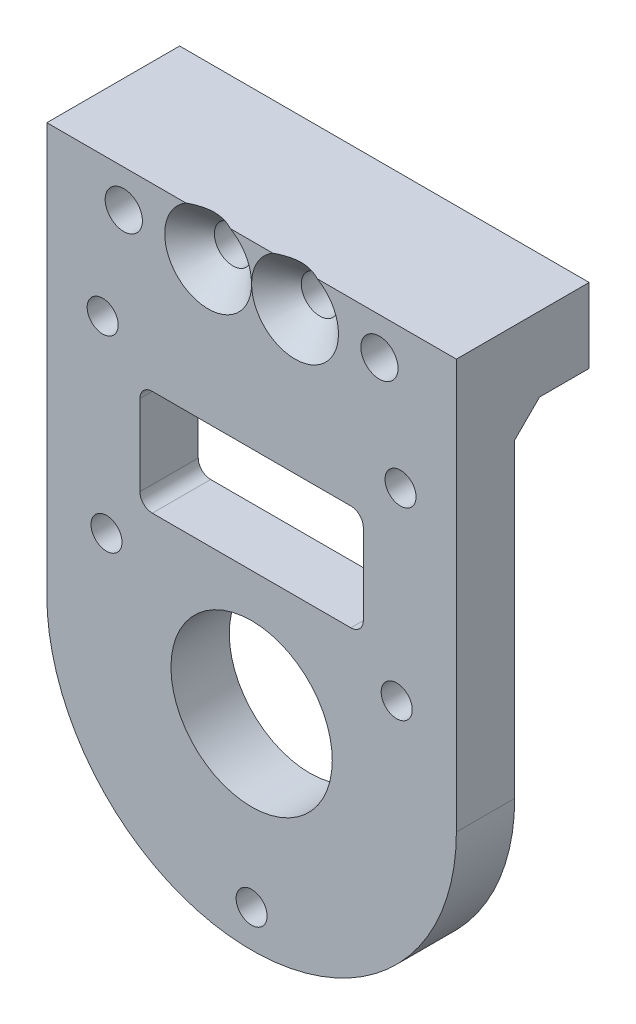
ISO-10303-21;
HEADER;
FILE_DESCRIPTION(('STEP AP214'),'2;1');
FILE_NAME('part.step','',(''),(''),'','','');
FILE_SCHEMA(('AUTOMOTIVE_DESIGN { 1 0 10303 214 1 1 1 1 }'));
ENDSEC;
DATA;
#1=APPLICATION_CONTEXT('core data for automotive mechanical design processes');
#2=APPLICATION_PROTOCOL_DEFINITION('international standard','automotive_design',2000,#1);
#3=PRODUCT_CONTEXT('',#1,'mechanical');
#4=PRODUCT('Part','Part','',(#3));
#5=PRODUCT_RELATED_PRODUCT_CATEGORY('part','',(#4));
#6=PRODUCT_DEFINITION_FORMATION('','',#4);
#7=PRODUCT_DEFINITION_CONTEXT('part definition',#1,'design');
#8=PRODUCT_DEFINITION('design','',#6,#7);
#9=PRODUCT_DEFINITION_SHAPE('','',#8);
#10=(LENGTH_UNIT() NAMED_UNIT(*) SI_UNIT(.MILLI.,.METRE.));
#11=(NAMED_UNIT(*) PLANE_ANGLE_UNIT() SI_UNIT($,.RADIAN.));
#12=(NAMED_UNIT(*) SI_UNIT($,.STERADIAN.) SOLID_ANGLE_UNIT());
#13=UNCERTAINTY_MEASURE_WITH_UNIT(LENGTH_MEASURE(1.E-05),#10,'distance_accuracy_value','');
#14=(GEOMETRIC_REPRESENTATION_CONTEXT(3) GLOBAL_UNCERTAINTY_ASSIGNED_CONTEXT((#13)) GLOBAL_UNIT_ASSIGNED_CONTEXT((#10,
#11,#12)) REPRESENTATION_CONTEXT('',''));
#15=CARTESIAN_POINT('',(0.,0.,0.));
#16=DIRECTION('',(0.,0.,1.));
#17=DIRECTION('',(1.,0.,0.));
#18=AXIS2_PLACEMENT_3D('',#15,#16,#17);
#19=CARTESIAN_POINT('',(-22.9121128013917,-0.330201782079756,4.7));
#20=DIRECTION('',(0.,0.,1.));
#21=DIRECTION('',(1.,0.,0.));
#22=AXIS2_PLACEMENT_3D('',#19,#20,#21);
#23=PLANE('',#22);
#24=CARTESIAN_POINT('',(-26.4121128013917,29.6698090418937,4.7));
#25=DIRECTION('',(0.,0.,-1.));
#26=DIRECTION('',(1.,0.,0.));
#27=AXIS2_PLACEMENT_3D('',#24,#25,#26);
#28=CIRCLE('',#27,3.5);
#29=CARTESIAN_POINT('',(-24.6093371636052,32.669809041861,4.7));
#30=VERTEX_POINT('',#29);
#31=CARTESIAN_POINT('',(-22.9121128013917,29.6698090418937,4.7));
#32=VERTEX_POINT('',#31);
#33=EDGE_CURVE('E33',#30,#32,#28,.T.);
#34=ORIENTED_EDGE('',*,*,#33,.T.);
#35=CARTESIAN_POINT('',(-19.4121128013917,29.6698090418937,4.7));
#36=DIRECTION('',(0.,0.,-1.));
#37=DIRECTION('',(1.,0.,0.));
#38=AXIS2_PLACEMENT_3D('',#35,#36,#37);
#39=CIRCLE('',#38,3.5);
#40=CARTESIAN_POINT('',(-21.2148884391781,32.669809041861,4.7));
#41=VERTEX_POINT('',#40);
#42=EDGE_CURVE('E11',#32,#41,#39,.T.);
#43=ORIENTED_EDGE('',*,*,#42,.T.);
#44=DIRECTION('',(-1.,0.,0.));
#45=VECTOR('',#44,1.);
#46=CARTESIAN_POINT('',(-6.41211280139168,32.6698090418611,4.7));
#47=LINE('',#46,#45);
#48=EDGE_CURVE('E371',#41,#30,#47,.T.);
#49=ORIENTED_EDGE('',*,*,#48,.T.);
#50=EDGE_LOOP('',(#34,#43,#49));
#51=FACE_BOUND('',#50,.T.);
#52=ADVANCED_FACE('F17',(#51),#23,.T.);
#53=CARTESIAN_POINT('',(0.,26.6698090416414,0.));
#54=DIRECTION('',(0.,-1.,0.));
#55=DIRECTION('',(0.,0.,-1.));
#56=AXIS2_PLACEMENT_3D('',#53,#54,#55);
#57=PLANE('',#56);
#58=DIRECTION('',(1.,0.,0.));
#59=VECTOR('',#58,1.);
#60=CARTESIAN_POINT('',(-39.4121128013917,26.6698090416414,-6.));
#61=LINE('',#60,#59);
#62=CARTESIAN_POINT('',(-39.4121128013917,26.6698090416414,-6.));
#63=VERTEX_POINT('',#62);
#64=CARTESIAN_POINT('',(-6.41211280139167,26.6698090416414,-6.));
#65=VERTEX_POINT('',#64);
#66=EDGE_CURVE('E194',#63,#65,#61,.T.);
#67=ORIENTED_EDGE('',*,*,#66,.T.);
#68=DIRECTION('',(0.,0.,1.));
#69=VECTOR('',#68,1.);
#70=CARTESIAN_POINT('',(-6.41211280139167,26.6698090416414,0.));
#71=LINE('',#70,#69);
#72=CARTESIAN_POINT('',(-6.41211280139167,26.6698090416414,-2.));
#73=VERTEX_POINT('',#72);
#74=EDGE_CURVE('E209',#65,#73,#71,.T.);
#75=ORIENTED_EDGE('',*,*,#74,.T.);
#76=DIRECTION('',(1.,0.,0.));
#77=VECTOR('',#76,1.);
#78=CARTESIAN_POINT('',(0.,26.6698090416414,-2.));
#79=LINE('',#78,#77);
#80=CARTESIAN_POINT('',(-39.4121128013917,26.6698090416414,-2.));
#81=VERTEX_POINT('',#80);
#82=EDGE_CURVE('E202',#81,#73,#79,.T.);
#83=ORIENTED_EDGE('',*,*,#82,.F.);
#84=DIRECTION('',(0.,0.,-1.));
#85=VECTOR('',#84,1.);
#86=CARTESIAN_POINT('',(-39.4121128013917,26.6698090416414,0.));
#87=LINE('',#86,#85);
#88=EDGE_CURVE('E206',#81,#63,#87,.T.);
#89=ORIENTED_EDGE('',*,*,#88,.T.);
#90=EDGE_LOOP('',(#67,#75,#83,#89));
#91=FACE_BOUND('',#90,.T.);
#92=ADVANCED_FACE('F204',(#91),#57,.T.);
#93=CARTESIAN_POINT('',(0.,24.6698090416413,0.));
#94=DIRECTION('',(0.,0.707106781186544,0.707106781186551));
#95=DIRECTION('',(1.,0.,0.));
#96=AXIS2_PLACEMENT_3D('',#93,#94,#95);
#97=PLANE('',#96);
#98=DIRECTION('',(0.,-0.70710678118655,0.707106781186545));
#99=VECTOR('',#98,1.);
#100=CARTESIAN_POINT('',(-39.4121128013917,27.6698090416414,-3.));
#101=LINE('',#100,#99);
#102=CARTESIAN_POINT('',(-39.4121128013917,24.6698090416413,0.));
#103=VERTEX_POINT('',#102);
#104=EDGE_CURVE('E216',#81,#103,#101,.T.);
#105=ORIENTED_EDGE('',*,*,#104,.F.);
#106=ORIENTED_EDGE('',*,*,#82,.T.);
#107=DIRECTION('',(0.,0.70710678118655,-0.707106781186545));
#108=VECTOR('',#107,1.);
#109=CARTESIAN_POINT('',(-6.41211280139167,24.6698090416413,0.));
#110=LINE('',#109,#108);
#111=CARTESIAN_POINT('',(-6.41211280139167,24.6698090416413,0.));
#112=VERTEX_POINT('',#111);
#113=EDGE_CURVE('E380',#112,#73,#110,.T.);
#114=ORIENTED_EDGE('',*,*,#113,.F.);
#115=DIRECTION('',(1.,0.,0.));
#116=VECTOR('',#115,1.);
#117=CARTESIAN_POINT('',(0.,24.6698090416413,0.));
#118=LINE('',#117,#116);
#119=EDGE_CURVE('E218',#103,#112,#118,.T.);
#120=ORIENTED_EDGE('',*,*,#119,.F.);
#121=EDGE_LOOP('',(#105,#106,#114,#120));
#122=FACE_BOUND('',#121,.T.);
#123=ADVANCED_FACE('F217',(#122),#97,.F.);
#124=CARTESIAN_POINT('',(-39.4121128013917,54.6698090418938,-6.));
#125=DIRECTION('',(0.,0.,1.));
#126=DIRECTION('',(0.,-1.,0.));
#127=AXIS2_PLACEMENT_3D('',#124,#125,#126);
#128=PLANE('',#127);
#129=CARTESIAN_POINT('',(-12.612112801392,29.6698090418937,-6.));
#130=DIRECTION('',(0.,0.,-1.));
#131=DIRECTION('',(0.,-1.,0.));
#132=AXIS2_PLACEMENT_3D('',#129,#130,#131);
#133=CIRCLE('',#132,1.5);
#134=CARTESIAN_POINT('',(-12.612112801392,28.1698090418937,-6.));
#135=VERTEX_POINT('',#134);
#136=EDGE_CURVE('E287',#135,#135,#133,.T.);
#137=ORIENTED_EDGE('',*,*,#136,.F.);
#138=EDGE_LOOP('',(#137));
#139=FACE_BOUND('',#138,.T.);
#140=CARTESIAN_POINT('',(-19.4121128013917,29.6698090418937,-6.));
#141=DIRECTION('',(0.,0.,-1.));
#142=DIRECTION('',(0.,-1.,0.));
#143=AXIS2_PLACEMENT_3D('',#140,#141,#142);
#144=CIRCLE('',#143,1.5);
#145=CARTESIAN_POINT('',(-19.4121128013917,28.1698090418937,-6.));
#146=VERTEX_POINT('',#145);
#147=EDGE_CURVE('E277',#146,#146,#144,.T.);
#148=ORIENTED_EDGE('',*,*,#147,.F.);
#149=EDGE_LOOP('',(#148));
#150=FACE_BOUND('',#149,.T.);
#151=CARTESIAN_POINT('',(-26.4121128013917,29.6698090418937,-6.));
#152=DIRECTION('',(0.,0.,-1.));
#153=DIRECTION('',(0.,-1.,0.));
#154=AXIS2_PLACEMENT_3D('',#151,#152,#153);
#155=CIRCLE('',#154,1.5);
#156=CARTESIAN_POINT('',(-26.4121128013917,28.1698090418937,-6.));
#157=VERTEX_POINT('',#156);
#158=EDGE_CURVE('E284',#157,#157,#155,.T.);
#159=ORIENTED_EDGE('',*,*,#158,.F.);
#160=EDGE_LOOP('',(#159));
#161=FACE_BOUND('',#160,.T.);
#162=CARTESIAN_POINT('',(-33.2121128013917,29.6698090418937,-6.));
#163=DIRECTION('',(0.,0.,-1.));
#164=DIRECTION('',(0.,-1.,0.));
#165=AXIS2_PLACEMENT_3D('',#162,#163,#164);
#166=CIRCLE('',#165,1.5);
#167=CARTESIAN_POINT('',(-33.2121128013917,28.1698090418937,-6.));
#168=VERTEX_POINT('',#167);
#169=EDGE_CURVE('E298',#168,#168,#166,.T.);
#170=ORIENTED_EDGE('',*,*,#169,.F.);
#171=EDGE_LOOP('',(#170));
#172=FACE_BOUND('',#171,.T.);
#173=DIRECTION('',(-1.,0.,0.));
#174=VECTOR('',#173,1.);
#175=CARTESIAN_POINT('',(-6.41211280139168,32.669809041861,-6.));
#176=LINE('',#175,#174);
#177=CARTESIAN_POINT('',(-6.41211280139168,32.6698090418611,-6.));
#178=VERTEX_POINT('',#177);
#179=CARTESIAN_POINT('',(-39.4121128013917,32.669809041861,-6.));
#180=VERTEX_POINT('',#179);
#181=EDGE_CURVE('E239',#178,#180,#176,.T.);
#182=ORIENTED_EDGE('',*,*,#181,.F.);
#183=DIRECTION('',(0.,-1.,0.));
#184=VECTOR('',#183,1.);
#185=CARTESIAN_POINT('',(-6.41211280139168,0.,-6.));
#186=LINE('',#185,#184);
#187=EDGE_CURVE('E355',#178,#65,#186,.T.);
#188=ORIENTED_EDGE('',*,*,#187,.T.);
#189=ORIENTED_EDGE('',*,*,#66,.F.);
#190=DIRECTION('',(0.,-1.,0.));
#191=VECTOR('',#190,1.);
#192=CARTESIAN_POINT('',(-39.4121128013917,54.6698090418938,-6.));
#193=LINE('',#192,#191);
#194=EDGE_CURVE('E227',#180,#63,#193,.T.);
#195=ORIENTED_EDGE('',*,*,#194,.F.);
#196=EDGE_LOOP('',(#182,#188,#189,#195));
#197=FACE_BOUND('',#196,.T.);
#198=ADVANCED_FACE('F508',(#139,#150,#161,#172,#197),#128,.F.);
#199=CARTESIAN_POINT('',(0.,0.,0.));
#200=DIRECTION('',(0.,0.,1.));
#201=DIRECTION('',(1.,0.,0.));
#202=AXIS2_PLACEMENT_3D('',#199,#200,#201);
#203=PLANE('',#202);
#204=CARTESIAN_POINT('',(-22.9121128013234,-13.8301909580808,0.));
#205=DIRECTION('',(0.,0.,1.));
#206=DIRECTION('',(1.,0.,0.));
#207=AXIS2_PLACEMENT_3D('',#204,#205,#206);
#208=CIRCLE('',#207,1.25);
#209=CARTESIAN_POINT('',(-21.6621128013234,-13.8301909580808,0.));
#210=VERTEX_POINT('',#209);
#211=EDGE_CURVE('E269',#210,#210,#208,.T.);
#212=ORIENTED_EDGE('',*,*,#211,.T.);
#213=EDGE_LOOP('',(#212));
#214=FACE_BOUND('',#213,.T.);
#215=CARTESIAN_POINT('',(-34.9121128013235,21.4198090419193,0.));
#216=DIRECTION('',(0.,0.,1.));
#217=DIRECTION('',(1.,0.,0.));
#218=AXIS2_PLACEMENT_3D('',#215,#216,#217);
#219=CIRCLE('',#218,1.25);
#220=CARTESIAN_POINT('',(-33.6621128013235,21.4198090419193,0.));
#221=VERTEX_POINT('',#220);
#222=EDGE_CURVE('E553',#221,#221,#219,.T.);
#223=ORIENTED_EDGE('',*,*,#222,.T.);
#224=EDGE_LOOP('',(#223));
#225=FACE_BOUND('',#224,.T.);
#226=CARTESIAN_POINT('',(-10.9121128013235,21.4198090419193,0.));
#227=DIRECTION('',(0.,0.,1.));
#228=DIRECTION('',(1.,0.,0.));
#229=AXIS2_PLACEMENT_3D('',#226,#227,#228);
#230=CIRCLE('',#229,1.25);
#231=CARTESIAN_POINT('',(-9.66211280132346,21.4198090419193,0.));
#232=VERTEX_POINT('',#231);
#233=EDGE_CURVE('E578',#232,#232,#230,.T.);
#234=ORIENTED_EDGE('',*,*,#233,.T.);
#235=EDGE_LOOP('',(#234));
#236=FACE_BOUND('',#235,.T.);
#237=CARTESIAN_POINT('',(-11.2207698502335,6.41980904191912,0.));
#238=DIRECTION('',(0.,0.,1.));
#239=DIRECTION('',(1.,0.,0.));
#240=AXIS2_PLACEMENT_3D('',#237,#238,#239);
#241=CIRCLE('',#240,1.25);
#242=CARTESIAN_POINT('',(-9.9707698502335,6.41980904191912,0.));
#243=VERTEX_POINT('',#242);
#244=EDGE_CURVE('E246',#243,#243,#241,.T.);
#245=ORIENTED_EDGE('',*,*,#244,.T.);
#246=EDGE_LOOP('',(#245));
#247=FACE_BOUND('',#246,.T.);
#248=CARTESIAN_POINT('',(-34.6034557524134,6.41980904191928,0.));
#249=DIRECTION('',(0.,0.,1.));
#250=DIRECTION('',(1.,0.,0.));
#251=AXIS2_PLACEMENT_3D('',#248,#249,#250);
#252=CIRCLE('',#251,1.25);
#253=CARTESIAN_POINT('',(-33.3534557524134,6.41980904191928,0.));
#254=VERTEX_POINT('',#253);
#255=EDGE_CURVE('E245',#254,#254,#252,.T.);
#256=ORIENTED_EDGE('',*,*,#255,.T.);
#257=EDGE_LOOP('',(#256));
#258=FACE_BOUND('',#257,.T.);
#259=CARTESIAN_POINT('',(-22.9121128013234,-0.330190958080774,0.));
#260=DIRECTION('',(0.,0.,1.));
#261=DIRECTION('',(1.,0.,0.));
#262=AXIS2_PLACEMENT_3D('',#259,#260,#261);
#263=CIRCLE('',#262,6.49999999996998);
#264=CARTESIAN_POINT('',(-16.4121128013535,-0.330190958080774,0.));
#265=VERTEX_POINT('',#264);
#266=EDGE_CURVE('E297',#265,#265,#263,.T.);
#267=ORIENTED_EDGE('',*,*,#266,.T.);
#268=EDGE_LOOP('',(#267));
#269=FACE_BOUND('',#268,.T.);
#270=DIRECTION('',(1.,0.,0.));
#271=VECTOR('',#270,1.);
#272=CARTESIAN_POINT('',(-13.9121128013917,9.66980904191923,0.));
#273=LINE('',#272,#271);
#274=CARTESIAN_POINT('',(-30.9121128013917,9.66980904191923,0.));
#275=VERTEX_POINT('',#274);
#276=CARTESIAN_POINT('',(-14.9121128013917,9.66980904191923,0.));
#277=VERTEX_POINT('',#276);
#278=EDGE_CURVE('E406',#275,#277,#273,.T.);
#279=ORIENTED_EDGE('',*,*,#278,.T.);
#280=CARTESIAN_POINT('',(-14.9121128013917,10.6698090419192,0.));
#281=DIRECTION('',(0.,0.,1.));
#282=DIRECTION('',(1.,0.,0.));
#283=AXIS2_PLACEMENT_3D('',#280,#281,#282);
#284=CIRCLE('',#283,1.);
#285=CARTESIAN_POINT('',(-13.9121128013917,10.6698090419192,0.));
#286=VERTEX_POINT('',#285);
#287=EDGE_CURVE('E336',#277,#286,#284,.T.);
#288=ORIENTED_EDGE('',*,*,#287,.T.);
#289=DIRECTION('',(0.,1.,0.));
#290=VECTOR('',#289,1.);
#291=CARTESIAN_POINT('',(-13.9121128013917,0.,0.));
#292=LINE('',#291,#290);
#293=CARTESIAN_POINT('',(-13.9121128013917,17.1698090419192,0.));
#294=VERTEX_POINT('',#293);
#295=EDGE_CURVE('E253',#286,#294,#292,.T.);
#296=ORIENTED_EDGE('',*,*,#295,.T.);
#297=CARTESIAN_POINT('',(-14.9121128013917,17.1698090419192,0.));
#298=DIRECTION('',(0.,0.,1.));
#299=DIRECTION('',(1.,0.,0.));
#300=AXIS2_PLACEMENT_3D('',#297,#298,#299);
#301=CIRCLE('',#300,1.);
#302=CARTESIAN_POINT('',(-14.9121128013917,18.1698090419192,0.));
#303=VERTEX_POINT('',#302);
#304=EDGE_CURVE('E339',#294,#303,#301,.T.);
#305=ORIENTED_EDGE('',*,*,#304,.T.);
#306=DIRECTION('',(-1.,0.,0.));
#307=VECTOR('',#306,1.);
#308=CARTESIAN_POINT('',(-13.9121128013917,18.1698090419192,0.));
#309=LINE('',#308,#307);
#310=CARTESIAN_POINT('',(-30.9121128013917,18.1698090419192,0.));
#311=VERTEX_POINT('',#310);
#312=EDGE_CURVE('E320',#303,#311,#309,.T.);
#313=ORIENTED_EDGE('',*,*,#312,.T.);
#314=CARTESIAN_POINT('',(-30.9121128013917,17.1698090419192,0.));
#315=DIRECTION('',(0.,0.,1.));
#316=DIRECTION('',(1.,0.,0.));
#317=AXIS2_PLACEMENT_3D('',#314,#315,#316);
#318=CIRCLE('',#317,1.);
#319=CARTESIAN_POINT('',(-31.9121128013917,17.1698090419192,0.));
#320=VERTEX_POINT('',#319);
#321=EDGE_CURVE('E48',#311,#320,#318,.T.);
#322=ORIENTED_EDGE('',*,*,#321,.T.);
#323=DIRECTION('',(0.,1.,0.));
#324=VECTOR('',#323,1.);
#325=CARTESIAN_POINT('',(-31.9121128013917,0.,0.));
#326=LINE('',#325,#324);
#327=CARTESIAN_POINT('',(-31.9121128013917,10.6698090419192,0.));
#328=VERTEX_POINT('',#327);
#329=EDGE_CURVE('E306',#328,#320,#326,.T.);
#330=ORIENTED_EDGE('',*,*,#329,.F.);
#331=CARTESIAN_POINT('',(-30.9121128013917,10.6698090419192,0.));
#332=DIRECTION('',(0.,0.,1.));
#333=DIRECTION('',(1.,0.,0.));
#334=AXIS2_PLACEMENT_3D('',#331,#332,#333);
#335=CIRCLE('',#334,1.);
#336=EDGE_CURVE('E124',#328,#275,#335,.T.);
#337=ORIENTED_EDGE('',*,*,#336,.T.);
#338=EDGE_LOOP('',(#279,#288,#296,#305,#313,#322,#330,#337));
#339=FACE_BOUND('',#338,.T.);
#340=ORIENTED_EDGE('',*,*,#119,.T.);
#341=DIRECTION('',(0.,1.,0.));
#342=VECTOR('',#341,1.);
#343=CARTESIAN_POINT('',(-6.41211280139168,0.,0.));
#344=LINE('',#343,#342);
#345=CARTESIAN_POINT('',(-6.41211280139168,-0.330201782079756,0.));
#346=VERTEX_POINT('',#345);
#347=EDGE_CURVE('E375',#346,#112,#344,.T.);
#348=ORIENTED_EDGE('',*,*,#347,.F.);
#349=CARTESIAN_POINT('',(-22.9121128013917,-0.330201782079756,0.));
#350=DIRECTION('',(0.,0.,1.));
#351=DIRECTION('',(1.,0.,0.));
#352=AXIS2_PLACEMENT_3D('',#349,#350,#351);
#353=CIRCLE('',#352,16.5);
#354=CARTESIAN_POINT('',(-39.4121128013917,-0.330201782079756,0.));
#355=VERTEX_POINT('',#354);
#356=EDGE_CURVE('E87',#355,#346,#353,.T.);
#357=ORIENTED_EDGE('',*,*,#356,.F.);
#358=DIRECTION('',(0.,1.,0.));
#359=VECTOR('',#358,1.);
#360=CARTESIAN_POINT('',(-39.4121128013917,0.,0.));
#361=LINE('',#360,#359);
#362=EDGE_CURVE('E222',#355,#103,#361,.T.);
#363=ORIENTED_EDGE('',*,*,#362,.T.);
#364=EDGE_LOOP('',(#340,#348,#357,#363));
#365=FACE_BOUND('',#364,.T.);
#366=ADVANCED_FACE('F472',(#214,#225,#236,#247,#258,#269,#339,#365),#203,.F.);
#367=CARTESIAN_POINT('',(-14.9121128013917,17.1698090419192,-6.));
#368=DIRECTION('',(0.,0.,-1.));
#369=DIRECTION('',(-1.,0.,0.));
#370=AXIS2_PLACEMENT_3D('',#367,#368,#369);
#371=CYLINDRICAL_SURFACE('',#370,1.);
#372=CARTESIAN_POINT('',(-14.9121128013917,17.1698090419192,4.7));
#373=DIRECTION('',(0.,0.,-1.));
#374=DIRECTION('',(1.,0.,0.));
#375=AXIS2_PLACEMENT_3D('',#372,#373,#374);
#376=CIRCLE('',#375,1.);
#377=CARTESIAN_POINT('',(-14.9121128013917,18.1698090419192,4.7));
#378=VERTEX_POINT('',#377);
#379=CARTESIAN_POINT('',(-13.9121128013917,17.1698090419192,4.7));
#380=VERTEX_POINT('',#379);
#381=EDGE_CURVE('E247',#378,#380,#376,.T.);
#382=ORIENTED_EDGE('',*,*,#381,.F.);
#383=DIRECTION('',(0.,0.,1.));
#384=VECTOR('',#383,1.);
#385=CARTESIAN_POINT('',(-14.9121128013917,18.1698090419192,24.2277563773199));
#386=LINE('',#385,#384);
#387=EDGE_CURVE('E397',#303,#378,#386,.T.);
#388=ORIENTED_EDGE('',*,*,#387,.F.);
#389=ORIENTED_EDGE('',*,*,#304,.F.);
#390=DIRECTION('',(0.,0.,-1.));
#391=VECTOR('',#390,1.);
#392=CARTESIAN_POINT('',(-13.9121128013917,17.1698090419192,-6.));
#393=LINE('',#392,#391);
#394=EDGE_CURVE('E258',#380,#294,#393,.T.);
#395=ORIENTED_EDGE('',*,*,#394,.F.);
#396=EDGE_LOOP('',(#382,#388,#389,#395));
#397=FACE_BOUND('',#396,.T.);
#398=ADVANCED_FACE('F468',(#397),#371,.F.);
#399=CARTESIAN_POINT('',(-14.9121128013917,10.6698090419192,24.2277563773199));
#400=DIRECTION('',(0.,0.,-1.));
#401=DIRECTION('',(-1.,0.,0.));
#402=AXIS2_PLACEMENT_3D('',#399,#400,#401);
#403=CYLINDRICAL_SURFACE('',#402,1.);
#404=CARTESIAN_POINT('',(-14.9121128013917,10.6698090419192,4.7));
#405=DIRECTION('',(0.,0.,-1.));
#406=DIRECTION('',(1.,0.,0.));
#407=AXIS2_PLACEMENT_3D('',#404,#405,#406);
#408=CIRCLE('',#407,1.);
#409=CARTESIAN_POINT('',(-13.9121128013917,10.6698090419192,4.7));
#410=VERTEX_POINT('',#409);
#411=CARTESIAN_POINT('',(-14.9121128013917,9.66980904191923,4.7));
#412=VERTEX_POINT('',#411);
#413=EDGE_CURVE('E327',#410,#412,#408,.T.);
#414=ORIENTED_EDGE('',*,*,#413,.F.);
#415=DIRECTION('',(0.,0.,1.));
#416=VECTOR('',#415,1.);
#417=CARTESIAN_POINT('',(-13.9121128013917,10.6698090419192,-6.));
#418=LINE('',#417,#416);
#419=EDGE_CURVE('E257',#286,#410,#418,.T.);
#420=ORIENTED_EDGE('',*,*,#419,.F.);
#421=ORIENTED_EDGE('',*,*,#287,.F.);
#422=DIRECTION('',(0.,0.,-1.));
#423=VECTOR('',#422,1.);
#424=CARTESIAN_POINT('',(-14.9121128013917,9.66980904191923,24.2277563773199));
#425=LINE('',#424,#423);
#426=EDGE_CURVE('E332',#412,#277,#425,.T.);
#427=ORIENTED_EDGE('',*,*,#426,.F.);
#428=EDGE_LOOP('',(#414,#420,#421,#427));
#429=FACE_BOUND('',#428,.T.);
#430=ADVANCED_FACE('F471',(#429),#403,.F.);
#431=CARTESIAN_POINT('',(-30.9121128013917,10.6698090419192,-6.));
#432=DIRECTION('',(0.,0.,1.));
#433=DIRECTION('',(1.,0.,0.));
#434=AXIS2_PLACEMENT_3D('',#431,#432,#433);
#435=CYLINDRICAL_SURFACE('',#434,1.);
#436=CARTESIAN_POINT('',(-30.9121128013917,10.6698090419192,4.7));
#437=DIRECTION('',(0.,0.,-1.));
#438=DIRECTION('',(1.,0.,0.));
#439=AXIS2_PLACEMENT_3D('',#436,#437,#438);
#440=CIRCLE('',#439,1.);
#441=CARTESIAN_POINT('',(-30.9121128013917,9.66980904191923,4.7));
#442=VERTEX_POINT('',#441);
#443=CARTESIAN_POINT('',(-31.9121128013917,10.6698090419192,4.7));
#444=VERTEX_POINT('',#443);
#445=EDGE_CURVE('E315',#442,#444,#440,.T.);
#446=ORIENTED_EDGE('',*,*,#445,.F.);
#447=DIRECTION('',(0.,0.,1.));
#448=VECTOR('',#447,1.);
#449=CARTESIAN_POINT('',(-30.9121128013917,9.66980904191923,6.2));
#450=LINE('',#449,#448);
#451=EDGE_CURVE('E328',#275,#442,#450,.T.);
#452=ORIENTED_EDGE('',*,*,#451,.F.);
#453=ORIENTED_EDGE('',*,*,#336,.F.);
#454=DIRECTION('',(0.,0.,-1.));
#455=VECTOR('',#454,1.);
#456=CARTESIAN_POINT('',(-31.9121128013917,10.6698090419192,0.));
#457=LINE('',#456,#455);
#458=EDGE_CURVE('E302',#444,#328,#457,.T.);
#459=ORIENTED_EDGE('',*,*,#458,.F.);
#460=EDGE_LOOP('',(#446,#452,#453,#459));
#461=FACE_BOUND('',#460,.T.);
#462=ADVANCED_FACE('F520',(#461),#435,.F.);
#463=CARTESIAN_POINT('',(-30.9121128013917,17.1698090419192,24.2277563773199));
#464=DIRECTION('',(0.,0.,1.));
#465=DIRECTION('',(1.,0.,0.));
#466=AXIS2_PLACEMENT_3D('',#463,#464,#465);
#467=CYLINDRICAL_SURFACE('',#466,1.);
#468=CARTESIAN_POINT('',(-30.9121128013917,17.1698090419192,4.7));
#469=DIRECTION('',(0.,0.,-1.));
#470=DIRECTION('',(1.,0.,0.));
#471=AXIS2_PLACEMENT_3D('',#468,#469,#470);
#472=CIRCLE('',#471,1.);
#473=CARTESIAN_POINT('',(-31.9121128013917,17.1698090419192,4.7));
#474=VERTEX_POINT('',#473);
#475=CARTESIAN_POINT('',(-30.9121128013917,18.1698090419192,4.7));
#476=VERTEX_POINT('',#475);
#477=EDGE_CURVE('E362',#474,#476,#472,.T.);
#478=ORIENTED_EDGE('',*,*,#477,.F.);
#479=DIRECTION('',(0.,0.,1.));
#480=VECTOR('',#479,1.);
#481=CARTESIAN_POINT('',(-31.9121128013917,17.1698090419192,6.2));
#482=LINE('',#481,#480);
#483=EDGE_CURVE('E307',#320,#474,#482,.T.);
#484=ORIENTED_EDGE('',*,*,#483,.F.);
#485=ORIENTED_EDGE('',*,*,#321,.F.);
#486=DIRECTION('',(0.,0.,-1.));
#487=VECTOR('',#486,1.);
#488=CARTESIAN_POINT('',(-30.9121128013917,18.1698090419192,0.));
#489=LINE('',#488,#487);
#490=EDGE_CURVE('E323',#476,#311,#489,.T.);
#491=ORIENTED_EDGE('',*,*,#490,.F.);
#492=EDGE_LOOP('',(#478,#484,#485,#491));
#493=FACE_BOUND('',#492,.T.);
#494=ADVANCED_FACE('F517',(#493),#467,.F.);
#495=CARTESIAN_POINT('',(-13.9121128013917,18.1698090419192,24.2277563773199));
#496=DIRECTION('',(0.,-1.,0.));
#497=DIRECTION('',(0.,0.,-1.));
#498=AXIS2_PLACEMENT_3D('',#495,#496,#497);
#499=PLANE('',#498);
#500=ORIENTED_EDGE('',*,*,#387,.T.);
#501=DIRECTION('',(-1.,0.,0.));
#502=VECTOR('',#501,1.);
#503=CARTESIAN_POINT('',(-13.9121128013917,18.1698090419192,4.7));
#504=LINE('',#503,#502);
#505=EDGE_CURVE('E252',#378,#476,#504,.T.);
#506=ORIENTED_EDGE('',*,*,#505,.T.);
#507=ORIENTED_EDGE('',*,*,#490,.T.);
#508=ORIENTED_EDGE('',*,*,#312,.F.);
#509=EDGE_LOOP('',(#500,#506,#507,#508));
#510=FACE_BOUND('',#509,.T.);
#511=ADVANCED_FACE('F515',(#510),#499,.T.);
#512=CARTESIAN_POINT('',(-13.9121128013917,9.66980904191923,24.2277563773199));
#513=DIRECTION('',(0.,1.,0.));
#514=DIRECTION('',(1.,0.,0.));
#515=AXIS2_PLACEMENT_3D('',#512,#513,#514);
#516=PLANE('',#515);
#517=ORIENTED_EDGE('',*,*,#451,.T.);
#518=DIRECTION('',(1.,0.,0.));
#519=VECTOR('',#518,1.);
#520=CARTESIAN_POINT('',(-13.9121128013917,9.66980904191923,4.7));
#521=LINE('',#520,#519);
#522=EDGE_CURVE('E367',#442,#412,#521,.T.);
#523=ORIENTED_EDGE('',*,*,#522,.T.);
#524=ORIENTED_EDGE('',*,*,#426,.T.);
#525=ORIENTED_EDGE('',*,*,#278,.F.);
#526=EDGE_LOOP('',(#517,#523,#524,#525));
#527=FACE_BOUND('',#526,.T.);
#528=ADVANCED_FACE('F511',(#527),#516,.T.);
#529=CARTESIAN_POINT('',(-31.9121128013917,0.,-6.));
#530=DIRECTION('',(1.,0.,0.));
#531=DIRECTION('',(0.,1.,0.));
#532=AXIS2_PLACEMENT_3D('',#529,#530,#531);
#533=PLANE('',#532);
#534=ORIENTED_EDGE('',*,*,#483,.T.);
#535=DIRECTION('',(0.,-1.,0.));
#536=VECTOR('',#535,1.);
#537=CARTESIAN_POINT('',(-31.9121128013917,0.,4.7));
#538=LINE('',#537,#536);
#539=EDGE_CURVE('E347',#474,#444,#538,.T.);
#540=ORIENTED_EDGE('',*,*,#539,.T.);
#541=ORIENTED_EDGE('',*,*,#458,.T.);
#542=ORIENTED_EDGE('',*,*,#329,.T.);
#543=EDGE_LOOP('',(#534,#540,#541,#542));
#544=FACE_BOUND('',#543,.T.);
#545=ADVANCED_FACE('F456',(#544),#533,.T.);
#546=CARTESIAN_POINT('',(-13.9121128013917,0.,-6.));
#547=DIRECTION('',(1.,0.,0.));
#548=DIRECTION('',(0.,1.,0.));
#549=AXIS2_PLACEMENT_3D('',#546,#547,#548);
#550=PLANE('',#549);
#551=DIRECTION('',(0.,-1.,0.));
#552=VECTOR('',#551,1.);
#553=CARTESIAN_POINT('',(-13.9121128013917,0.,4.7));
#554=LINE('',#553,#552);
#555=EDGE_CURVE('E251',#380,#410,#554,.T.);
#556=ORIENTED_EDGE('',*,*,#555,.F.);
#557=ORIENTED_EDGE('',*,*,#394,.T.);
#558=ORIENTED_EDGE('',*,*,#295,.F.);
#559=ORIENTED_EDGE('',*,*,#419,.T.);
#560=EDGE_LOOP('',(#556,#557,#558,#559));
#561=FACE_BOUND('',#560,.T.);
#562=ADVANCED_FACE('F452',(#561),#550,.F.);
#563=CARTESIAN_POINT('',(-22.9121128013917,-0.330201782079756,0.));
#564=DIRECTION('',(0.,0.,1.));
#565=DIRECTION('',(1.,0.,0.));
#566=AXIS2_PLACEMENT_3D('',#563,#564,#565);
#567=CYLINDRICAL_SURFACE('',#566,16.5);
#568=DIRECTION('',(0.,0.,1.));
#569=VECTOR('',#568,1.);
#570=CARTESIAN_POINT('',(-6.41211280139168,-0.330201782079756,0.));
#571=LINE('',#570,#569);
#572=CARTESIAN_POINT('',(-6.41211280139168,-0.330201782079756,4.7));
#573=VERTEX_POINT('',#572);
#574=EDGE_CURVE('E372',#346,#573,#571,.T.);
#575=ORIENTED_EDGE('',*,*,#574,.T.);
#576=CARTESIAN_POINT('',(-22.9121128013917,-0.330201782079756,4.7));
#577=DIRECTION('',(0.,0.,1.));
#578=DIRECTION('',(1.,0.,0.));
#579=AXIS2_PLACEMENT_3D('',#576,#577,#578);
#580=CIRCLE('',#579,16.5);
#581=CARTESIAN_POINT('',(-39.4121128013917,-0.330201782079756,4.7));
#582=VERTEX_POINT('',#581);
#583=EDGE_CURVE('E316',#582,#573,#580,.T.);
#584=ORIENTED_EDGE('',*,*,#583,.F.);
#585=DIRECTION('',(0.,0.,1.));
#586=VECTOR('',#585,1.);
#587=CARTESIAN_POINT('',(-39.4121128013917,-0.330201782079756,0.));
#588=LINE('',#587,#586);
#589=EDGE_CURVE('E265',#355,#582,#588,.T.);
#590=ORIENTED_EDGE('',*,*,#589,.F.);
#591=ORIENTED_EDGE('',*,*,#356,.T.);
#592=EDGE_LOOP('',(#575,#584,#590,#591));
#593=FACE_BOUND('',#592,.T.);
#594=ADVANCED_FACE('F455',(#593),#567,.T.);
#595=CARTESIAN_POINT('',(-6.41211280139168,0.,0.));
#596=DIRECTION('',(1.,0.,0.));
#597=DIRECTION('',(0.,1.,0.));
#598=AXIS2_PLACEMENT_3D('',#595,#596,#597);
#599=PLANE('',#598);
#600=DIRECTION('',(0.,0.,1.));
#601=VECTOR('',#600,1.);
#602=CARTESIAN_POINT('',(-6.41211280139168,32.6698090418611,-6.));
#603=LINE('',#602,#601);
#604=CARTESIAN_POINT('',(-6.41211280139168,32.6698090418611,4.7));
#605=VERTEX_POINT('',#604);
#606=EDGE_CURVE('E278',#178,#605,#603,.T.);
#607=ORIENTED_EDGE('',*,*,#606,.T.);
#608=DIRECTION('',(0.,1.,0.));
#609=VECTOR('',#608,1.);
#610=CARTESIAN_POINT('',(-6.41211280139168,-0.330201782079756,4.7));
#611=LINE('',#610,#609);
#612=EDGE_CURVE('E311',#573,#605,#611,.T.);
#613=ORIENTED_EDGE('',*,*,#612,.F.);
#614=ORIENTED_EDGE('',*,*,#574,.F.);
#615=ORIENTED_EDGE('',*,*,#347,.T.);
#616=ORIENTED_EDGE('',*,*,#113,.T.);
#617=ORIENTED_EDGE('',*,*,#74,.F.);
#618=ORIENTED_EDGE('',*,*,#187,.F.);
#619=EDGE_LOOP('',(#607,#613,#614,#615,#616,#617,#618));
#620=FACE_BOUND('',#619,.T.);
#621=ADVANCED_FACE('F442',(#620),#599,.T.);
#622=CARTESIAN_POINT('',(0.,32.669809041861,0.));
#623=DIRECTION('',(0.,1.,0.));
#624=DIRECTION('',(1.,0.,0.));
#625=AXIS2_PLACEMENT_3D('',#622,#623,#624);
#626=PLANE('',#625);
#627=ORIENTED_EDGE('',*,*,#48,.F.);
#628=CARTESIAN_POINT('',(-21.2148884391782,32.669809041861,4.69999999999999));
#629=CARTESIAN_POINT('',(-21.1531167676772,32.669809041861,4.66818899112448));
#630=CARTESIAN_POINT('',(-21.0908619917285,32.669809041861,4.63731795904256));
#631=CARTESIAN_POINT('',(-20.9652751043861,32.669809041861,4.57775738070353));
#632=CARTESIAN_POINT('',(-20.9019423862405,32.669809041861,4.54906911635902));
#633=CARTESIAN_POINT('',(-20.7094878978594,32.669809041861,4.46645014603238));
#634=CARTESIAN_POINT('',(-20.5786637834101,32.669809041861,4.41636255294149));
#635=CARTESIAN_POINT('',(-20.3148608736325,32.669809041861,4.33044710722541));
#636=CARTESIAN_POINT('',(-20.1819599208902,32.669809041861,4.29438491702501));
#637=CARTESIAN_POINT('',(-19.9130077964792,32.669809041861,4.23870442333006));
#638=CARTESIAN_POINT('',(-19.7769666593126,32.669809041861,4.21903964372527));
#639=CARTESIAN_POINT('',(-19.5460974526302,32.669809041861,4.20151511052085));
#640=CARTESIAN_POINT('',(-19.4516235741075,32.669809041861,4.19877303568888));
#641=CARTESIAN_POINT('',(-19.2627968663001,32.669809041861,4.20223164535983));
#642=CARTESIAN_POINT('',(-19.1684440953709,32.669809041861,4.20843566870244));
#643=CARTESIAN_POINT('',(-18.9805972883769,32.669809041861,4.22943429400892));
#644=CARTESIAN_POINT('',(-18.8871045016728,32.669809041861,4.24423984738769));
#645=CARTESIAN_POINT('',(-18.7017154762193,32.669809041861,4.28162556557305));
#646=CARTESIAN_POINT('',(-18.6098191229694,32.669809041861,4.30420517036506));
#647=CARTESIAN_POINT('',(-18.4399584825355,32.669809041861,4.35267392188776));
#648=CARTESIAN_POINT('',(-18.3617538612436,32.669809041861,4.37773503258728));
#649=CARTESIAN_POINT('',(-18.206880653382,32.669809041861,4.43223307621308));
#650=CARTESIAN_POINT('',(-18.1302122955706,32.669809041861,4.46167065540551));
#651=CARTESIAN_POINT('',(-17.9786370237375,32.669809041861,4.52416781542787));
#652=CARTESIAN_POINT('',(-17.9037257022585,32.669809041861,4.55721680558489));
#653=CARTESIAN_POINT('',(-17.755426595466,32.669809041861,4.62641710116638));
#654=CARTESIAN_POINT('',(-17.6820375185961,32.669809041861,4.6625656308409));
#655=CARTESIAN_POINT('',(-17.6093371636052,32.669809041861,4.70000000000001));
#656=B_SPLINE_CURVE_WITH_KNOTS('',3,(#628,#629,#630,#631,#632,#633,#634,#635,#636,#637,#638,
#639,#640,#641,#642,#643,#644,#645,#646,#647,#648,#649,#650,#651,#652,#653,#654,#655),
.UNSPECIFIED.,.F.,.F.,(4,2,2,2,2,2,2,2,2,2,2,2,2,4),(0.,0.208428681018323,0.416978839640619,
0.836629720960625,1.24893230123187,1.66006225793803,1.94320380415328,2.22645105108028,
2.5100597194403,2.79364796192987,3.03987144159966,3.28613131688033,3.53168747621512,
3.7770259830431),.UNSPECIFIED.);
#657=CARTESIAN_POINT('',(-17.6093371636052,32.669809041861,4.7));
#658=VERTEX_POINT('',#657);
#659=EDGE_CURVE('E20',#41,#658,#656,.T.);
#660=ORIENTED_EDGE('',*,*,#659,.T.);
#661=DIRECTION('',(-1.,0.,0.));
#662=VECTOR('',#661,1.);
#663=CARTESIAN_POINT('',(-6.41211280139168,32.6698090418611,4.7));
#664=LINE('',#663,#662);
#665=EDGE_CURVE('E343',#605,#658,#664,.T.);
#666=ORIENTED_EDGE('',*,*,#665,.F.);
#667=ORIENTED_EDGE('',*,*,#606,.F.);
#668=ORIENTED_EDGE('',*,*,#181,.T.);
#669=DIRECTION('',(0.,0.,1.));
#670=VECTOR('',#669,1.);
#671=CARTESIAN_POINT('',(-39.4121128013917,32.669809041861,-6.));
#672=LINE('',#671,#670);
#673=CARTESIAN_POINT('',(-39.4121128013917,32.669809041861,4.7));
#674=VERTEX_POINT('',#673);
#675=EDGE_CURVE('E235',#180,#674,#672,.T.);
#676=ORIENTED_EDGE('',*,*,#675,.T.);
#677=DIRECTION('',(-1.,0.,0.));
#678=VECTOR('',#677,1.);
#679=CARTESIAN_POINT('',(-6.41211280139168,32.6698090418611,4.7));
#680=LINE('',#679,#678);
#681=CARTESIAN_POINT('',(-28.2148884391781,32.669809041861,4.69999999999999));
#682=VERTEX_POINT('',#681);
#683=EDGE_CURVE('E352',#682,#674,#680,.T.);
#684=ORIENTED_EDGE('',*,*,#683,.F.);
#685=CARTESIAN_POINT('',(-28.2148884391782,32.669809041861,4.69999999999999));
#686=CARTESIAN_POINT('',(-28.1531167676772,32.669809041861,4.66818899112448));
#687=CARTESIAN_POINT('',(-28.0908619917285,32.669809041861,4.63731795904256));
#688=CARTESIAN_POINT('',(-27.9652751043861,32.669809041861,4.57775738070353));
#689=CARTESIAN_POINT('',(-27.9019423862405,32.669809041861,4.54906911635902));
#690=CARTESIAN_POINT('',(-27.7094878978594,32.669809041861,4.46645014603238));
#691=CARTESIAN_POINT('',(-27.5786637834101,32.669809041861,4.41636255294149));
#692=CARTESIAN_POINT('',(-27.3148608736326,32.669809041861,4.33044710722541));
#693=CARTESIAN_POINT('',(-27.1819599208902,32.669809041861,4.29438491702501));
#694=CARTESIAN_POINT('',(-26.9130077964792,32.669809041861,4.23870442333006));
#695=CARTESIAN_POINT('',(-26.7769666593126,32.669809041861,4.21903964372527));
#696=CARTESIAN_POINT('',(-26.5460974526302,32.669809041861,4.20151511052085));
#697=CARTESIAN_POINT('',(-26.4516235741075,32.669809041861,4.19877303568888));
#698=CARTESIAN_POINT('',(-26.2627968663001,32.669809041861,4.20223164535983));
#699=CARTESIAN_POINT('',(-26.1684440953709,32.669809041861,4.20843566870244));
#700=CARTESIAN_POINT('',(-25.9805972883769,32.669809041861,4.22943429400892));
#701=CARTESIAN_POINT('',(-25.8871045016728,32.669809041861,4.24423984738769));
#702=CARTESIAN_POINT('',(-25.7017154762193,32.669809041861,4.28162556557305));
#703=CARTESIAN_POINT('',(-25.6098191229694,32.669809041861,4.30420517036506));
#704=CARTESIAN_POINT('',(-25.4399584825355,32.669809041861,4.35267392188776));
#705=CARTESIAN_POINT('',(-25.3617538612436,32.669809041861,4.37773503258728));
#706=CARTESIAN_POINT('',(-25.206880653382,32.669809041861,4.43223307621308));
#707=CARTESIAN_POINT('',(-25.1302122955706,32.669809041861,4.46167065540551));
#708=CARTESIAN_POINT('',(-24.9786370237375,32.669809041861,4.52416781542787));
#709=CARTESIAN_POINT('',(-24.9037257022585,32.669809041861,4.55721680558489));
#710=CARTESIAN_POINT('',(-24.755426595466,32.669809041861,4.62641710116637));
#711=CARTESIAN_POINT('',(-24.6820375185961,32.669809041861,4.6625656308409));
#712=CARTESIAN_POINT('',(-24.6093371636052,32.669809041861,4.7));
#713=B_SPLINE_CURVE_WITH_KNOTS('',3,(#685,#686,#687,#688,#689,#690,#691,#692,#693,#694,#695,
#696,#697,#698,#699,#700,#701,#702,#703,#704,#705,#706,#707,#708,#709,#710,#711,#712),
.UNSPECIFIED.,.F.,.F.,(4,2,2,2,2,2,2,2,2,2,2,2,2,4),(0.,0.208428681018319,0.416978839640615,
0.836629720960625,1.24893230123186,1.66006225793803,1.94320380415328,2.22645105108028,
2.5100597194403,2.79364796192987,3.03987144159966,3.28613131688033,3.53168747621511,
3.77702598304309),.UNSPECIFIED.);
#714=EDGE_CURVE('E376',#682,#30,#713,.T.);
#715=ORIENTED_EDGE('',*,*,#714,.T.);
#716=EDGE_LOOP('',(#627,#660,#666,#667,#668,#676,#684,#715));
#717=FACE_BOUND('',#716,.T.);
#718=ADVANCED_FACE('F437',(#717),#626,.T.);
#719=CARTESIAN_POINT('',(-39.4121128013917,0.,0.));
#720=DIRECTION('',(1.,0.,0.));
#721=DIRECTION('',(0.,1.,0.));
#722=AXIS2_PLACEMENT_3D('',#719,#720,#721);
#723=PLANE('',#722);
#724=DIRECTION('',(0.,-1.,0.));
#725=VECTOR('',#724,1.);
#726=CARTESIAN_POINT('',(-39.4121128013917,32.669809041861,4.7));
#727=LINE('',#726,#725);
#728=EDGE_CURVE('E348',#674,#582,#727,.T.);
#729=ORIENTED_EDGE('',*,*,#728,.F.);
#730=ORIENTED_EDGE('',*,*,#675,.F.);
#731=ORIENTED_EDGE('',*,*,#194,.T.);
#732=ORIENTED_EDGE('',*,*,#88,.F.);
#733=ORIENTED_EDGE('',*,*,#104,.T.);
#734=ORIENTED_EDGE('',*,*,#362,.F.);
#735=ORIENTED_EDGE('',*,*,#589,.T.);
#736=EDGE_LOOP('',(#729,#730,#731,#732,#733,#734,#735));
#737=FACE_BOUND('',#736,.T.);
#738=ADVANCED_FACE('F225',(#737),#723,.F.);
#739=CARTESIAN_POINT('',(-22.9121128013917,-0.330201782079756,4.7));
#740=DIRECTION('',(0.,0.,1.));
#741=DIRECTION('',(1.,0.,0.));
#742=AXIS2_PLACEMENT_3D('',#739,#740,#741);
#743=PLANE('',#742);
#744=CARTESIAN_POINT('',(-22.9121128013234,-0.330190958080774,4.7));
#745=DIRECTION('',(0.,0.,1.));
#746=DIRECTION('',(1.,0.,0.));
#747=AXIS2_PLACEMENT_3D('',#744,#745,#746);
#748=CIRCLE('',#747,6.49999999996998);
#749=CARTESIAN_POINT('',(-16.4121128013535,-0.330190958080774,4.7));
#750=VERTEX_POINT('',#749);
#751=EDGE_CURVE('E293',#750,#750,#748,.T.);
#752=ORIENTED_EDGE('',*,*,#751,.F.);
#753=EDGE_LOOP('',(#752));
#754=FACE_BOUND('',#753,.T.);
#755=ORIENTED_EDGE('',*,*,#445,.T.);
#756=ORIENTED_EDGE('',*,*,#539,.F.);
#757=ORIENTED_EDGE('',*,*,#477,.T.);
#758=ORIENTED_EDGE('',*,*,#505,.F.);
#759=ORIENTED_EDGE('',*,*,#381,.T.);
#760=ORIENTED_EDGE('',*,*,#555,.T.);
#761=ORIENTED_EDGE('',*,*,#413,.T.);
#762=ORIENTED_EDGE('',*,*,#522,.F.);
#763=EDGE_LOOP('',(#755,#756,#757,#758,#759,#760,#761,#762));
#764=FACE_BOUND('',#763,.T.);
#765=CARTESIAN_POINT('',(-34.9121128013235,21.4198090419193,4.7));
#766=DIRECTION('',(0.,0.,-1.));
#767=DIRECTION('',(1.,0.,0.));
#768=AXIS2_PLACEMENT_3D('',#765,#766,#767);
#769=CIRCLE('',#768,1.25);
#770=CARTESIAN_POINT('',(-33.6621128013235,21.4198090419193,4.7));
#771=VERTEX_POINT('',#770);
#772=EDGE_CURVE('E571',#771,#771,#769,.T.);
#773=ORIENTED_EDGE('',*,*,#772,.T.);
#774=EDGE_LOOP('',(#773));
#775=FACE_BOUND('',#774,.T.);
#776=CARTESIAN_POINT('',(-10.9121128013235,21.4198090419193,4.7));
#777=DIRECTION('',(0.,0.,-1.));
#778=DIRECTION('',(1.,0.,0.));
#779=AXIS2_PLACEMENT_3D('',#776,#777,#778);
#780=CIRCLE('',#779,1.25);
#781=CARTESIAN_POINT('',(-9.66211280132346,21.4198090419193,4.7));
#782=VERTEX_POINT('',#781);
#783=EDGE_CURVE('E575',#782,#782,#780,.T.);
#784=ORIENTED_EDGE('',*,*,#783,.T.);
#785=EDGE_LOOP('',(#784));
#786=FACE_BOUND('',#785,.T.);
#787=CARTESIAN_POINT('',(-11.2207698502335,6.41980904191912,4.7));
#788=DIRECTION('',(0.,0.,-1.));
#789=DIRECTION('',(1.,0.,0.));
#790=AXIS2_PLACEMENT_3D('',#787,#788,#789);
#791=CIRCLE('',#790,1.25);
#792=CARTESIAN_POINT('',(-9.9707698502335,6.41980904191912,4.7));
#793=VERTEX_POINT('',#792);
#794=EDGE_CURVE('E241',#793,#793,#791,.T.);
#795=ORIENTED_EDGE('',*,*,#794,.T.);
#796=EDGE_LOOP('',(#795));
#797=FACE_BOUND('',#796,.T.);
#798=CARTESIAN_POINT('',(-34.6034557524134,6.41980904191928,4.7));
#799=DIRECTION('',(0.,0.,-1.));
#800=DIRECTION('',(1.,0.,0.));
#801=AXIS2_PLACEMENT_3D('',#798,#799,#800);
#802=CIRCLE('',#801,1.25);
#803=CARTESIAN_POINT('',(-33.3534557524134,6.41980904191928,4.7));
#804=VERTEX_POINT('',#803);
#805=EDGE_CURVE('E262',#804,#804,#802,.T.);
#806=ORIENTED_EDGE('',*,*,#805,.T.);
#807=EDGE_LOOP('',(#806));
#808=FACE_BOUND('',#807,.T.);
#809=CARTESIAN_POINT('',(-22.9121128013234,-13.8301909580808,4.7));
#810=DIRECTION('',(0.,0.,-1.));
#811=DIRECTION('',(1.,0.,0.));
#812=AXIS2_PLACEMENT_3D('',#809,#810,#811);
#813=CIRCLE('',#812,1.25);
#814=CARTESIAN_POINT('',(-21.6621128013234,-13.8301909580808,4.7));
#815=VERTEX_POINT('',#814);
#816=EDGE_CURVE('E273',#815,#815,#813,.T.);
#817=ORIENTED_EDGE('',*,*,#816,.T.);
#818=EDGE_LOOP('',(#817));
#819=FACE_BOUND('',#818,.T.);
#820=CARTESIAN_POINT('',(-12.612112801392,29.6698090418937,4.7));
#821=DIRECTION('',(0.,0.,-1.));
#822=DIRECTION('',(1.,0.,0.));
#823=AXIS2_PLACEMENT_3D('',#820,#821,#822);
#824=CIRCLE('',#823,1.5);
#825=CARTESIAN_POINT('',(-11.112112801392,29.6698090418937,4.7));
#826=VERTEX_POINT('',#825);
#827=EDGE_CURVE('E292',#826,#826,#824,.T.);
#828=ORIENTED_EDGE('',*,*,#827,.T.);
#829=EDGE_LOOP('',(#828));
#830=FACE_BOUND('',#829,.T.);
#831=CARTESIAN_POINT('',(-33.2121128013917,29.6698090418937,4.7));
#832=DIRECTION('',(0.,0.,-1.));
#833=DIRECTION('',(1.,0.,0.));
#834=AXIS2_PLACEMENT_3D('',#831,#832,#833);
#835=CIRCLE('',#834,1.5);
#836=CARTESIAN_POINT('',(-31.7121128013917,29.6698090418937,4.7));
#837=VERTEX_POINT('',#836);
#838=EDGE_CURVE('E291',#837,#837,#835,.T.);
#839=ORIENTED_EDGE('',*,*,#838,.T.);
#840=EDGE_LOOP('',(#839));
#841=FACE_BOUND('',#840,.T.);
#842=ORIENTED_EDGE('',*,*,#665,.T.);
#843=CARTESIAN_POINT('',(-19.4121128013917,29.6698090418937,4.7));
#844=DIRECTION('',(0.,0.,-1.));
#845=DIRECTION('',(1.,0.,0.));
#846=AXIS2_PLACEMENT_3D('',#843,#844,#845);
#847=CIRCLE('',#846,3.5);
#848=EDGE_CURVE('E547',#658,#32,#847,.T.);
#849=ORIENTED_EDGE('',*,*,#848,.T.);
#850=CARTESIAN_POINT('',(-26.4121128013917,29.6698090418937,4.7));
#851=DIRECTION('',(0.,0.,-1.));
#852=DIRECTION('',(1.,0.,0.));
#853=AXIS2_PLACEMENT_3D('',#850,#851,#852);
#854=CIRCLE('',#853,3.5);
#855=EDGE_CURVE('E548',#32,#682,#854,.T.);
#856=ORIENTED_EDGE('',*,*,#855,.T.);
#857=ORIENTED_EDGE('',*,*,#683,.T.);
#858=ORIENTED_EDGE('',*,*,#728,.T.);
#859=ORIENTED_EDGE('',*,*,#583,.T.);
#860=ORIENTED_EDGE('',*,*,#612,.T.);
#861=EDGE_LOOP('',(#842,#849,#856,#857,#858,#859,#860));
#862=FACE_BOUND('',#861,.T.);
#863=ADVANCED_FACE('F450',(#754,#764,#775,#786,#797,#808,#819,#830,#841,#862),#743,.T.);
#864=CARTESIAN_POINT('',(-22.9121128013234,-0.330190958080774,3.));
#865=DIRECTION('',(0.,0.,-1.));
#866=DIRECTION('',(-1.,0.,0.));
#867=AXIS2_PLACEMENT_3D('',#864,#865,#866);
#868=CYLINDRICAL_SURFACE('',#867,6.49999999996998);
#869=ORIENTED_EDGE('',*,*,#266,.F.);
#870=EDGE_LOOP('',(#869));
#871=FACE_BOUND('',#870,.T.);
#872=ORIENTED_EDGE('',*,*,#751,.T.);
#873=EDGE_LOOP('',(#872));
#874=FACE_BOUND('',#873,.T.);
#875=ADVANCED_FACE('F445',(#871,#874),#868,.F.);
#876=CARTESIAN_POINT('',(-33.2121128013917,29.6698090418937,-13.7573593128807));
#877=DIRECTION('',(0.,0.,-1.));
#878=DIRECTION('',(-1.,0.,0.));
#879=AXIS2_PLACEMENT_3D('',#876,#877,#878);
#880=CYLINDRICAL_SURFACE('',#879,1.5);
#881=ORIENTED_EDGE('',*,*,#169,.T.);
#882=EDGE_LOOP('',(#881));
#883=FACE_BOUND('',#882,.T.);
#884=ORIENTED_EDGE('',*,*,#838,.F.);
#885=EDGE_LOOP('',(#884));
#886=FACE_BOUND('',#885,.T.);
#887=ADVANCED_FACE('F449',(#883,#886),#880,.F.);
#888=CARTESIAN_POINT('',(-12.612112801392,29.6698090418937,-13.7573593128807));
#889=DIRECTION('',(0.,0.,-1.));
#890=DIRECTION('',(-1.,0.,0.));
#891=AXIS2_PLACEMENT_3D('',#888,#889,#890);
#892=CYLINDRICAL_SURFACE('',#891,1.5);
#893=ORIENTED_EDGE('',*,*,#136,.T.);
#894=EDGE_LOOP('',(#893));
#895=FACE_BOUND('',#894,.T.);
#896=ORIENTED_EDGE('',*,*,#827,.F.);
#897=EDGE_LOOP('',(#896));
#898=FACE_BOUND('',#897,.T.);
#899=ADVANCED_FACE('F458',(#895,#898),#892,.F.);
#900=CARTESIAN_POINT('',(-26.4121128013917,29.6698090418937,6.3));
#901=DIRECTION('',(0.,0.,-1.));
#902=DIRECTION('',(-1.,0.,0.));
#903=AXIS2_PLACEMENT_3D('',#900,#901,#902);
#904=CYLINDRICAL_SURFACE('',#903,1.5);
#905=ORIENTED_EDGE('',*,*,#158,.T.);
#906=EDGE_LOOP('',(#905));
#907=FACE_BOUND('',#906,.T.);
#908=CARTESIAN_POINT('',(-26.4121128013917,29.6698090418937,2.7));
#909=DIRECTION('',(0.,0.,1.));
#910=DIRECTION('',(1.,0.,0.));
#911=AXIS2_PLACEMENT_3D('',#908,#909,#910);
#912=CIRCLE('',#911,1.5);
#913=CARTESIAN_POINT('',(-24.9121128013917,29.6698090418937,2.7));
#914=VERTEX_POINT('',#913);
#915=EDGE_CURVE('E559',#914,#914,#912,.T.);
#916=ORIENTED_EDGE('',*,*,#915,.T.);
#917=EDGE_LOOP('',(#916));
#918=FACE_BOUND('',#917,.T.);
#919=ADVANCED_FACE('F461',(#907,#918),#904,.F.);
#920=CARTESIAN_POINT('',(-19.4121128013917,29.6698090418937,6.3));
#921=DIRECTION('',(0.,0.,-1.));
#922=DIRECTION('',(-1.,0.,0.));
#923=AXIS2_PLACEMENT_3D('',#920,#921,#922);
#924=CYLINDRICAL_SURFACE('',#923,1.5);
#925=ORIENTED_EDGE('',*,*,#147,.T.);
#926=EDGE_LOOP('',(#925));
#927=FACE_BOUND('',#926,.T.);
#928=CARTESIAN_POINT('',(-19.4121128013917,29.6698090418937,2.7));
#929=DIRECTION('',(0.,0.,1.));
#930=DIRECTION('',(1.,0.,0.));
#931=AXIS2_PLACEMENT_3D('',#928,#929,#930);
#932=CIRCLE('',#931,1.5);
#933=CARTESIAN_POINT('',(-17.9121128013917,29.6698090418937,2.7));
#934=VERTEX_POINT('',#933);
#935=EDGE_CURVE('E554',#934,#934,#932,.T.);
#936=ORIENTED_EDGE('',*,*,#935,.T.);
#937=EDGE_LOOP('',(#936));
#938=FACE_BOUND('',#937,.T.);
#939=ADVANCED_FACE('F478',(#927,#938),#924,.F.);
#940=CARTESIAN_POINT('',(-22.9121128013234,-13.8301909580808,-6.));
#941=DIRECTION('',(0.,0.,1.));
#942=DIRECTION('',(1.,0.,0.));
#943=AXIS2_PLACEMENT_3D('',#940,#941,#942);
#944=CYLINDRICAL_SURFACE('',#943,1.25);
#945=ORIENTED_EDGE('',*,*,#816,.F.);
#946=EDGE_LOOP('',(#945));
#947=FACE_BOUND('',#946,.T.);
#948=ORIENTED_EDGE('',*,*,#211,.F.);
#949=EDGE_LOOP('',(#948));
#950=FACE_BOUND('',#949,.T.);
#951=ADVANCED_FACE('F474',(#947,#950),#944,.F.);
#952=CARTESIAN_POINT('',(-34.6034557524134,6.41980904191928,-6.));
#953=DIRECTION('',(0.,0.,1.));
#954=DIRECTION('',(1.,0.,0.));
#955=AXIS2_PLACEMENT_3D('',#952,#953,#954);
#956=CYLINDRICAL_SURFACE('',#955,1.25);
#957=ORIENTED_EDGE('',*,*,#805,.F.);
#958=EDGE_LOOP('',(#957));
#959=FACE_BOUND('',#958,.T.);
#960=ORIENTED_EDGE('',*,*,#255,.F.);
#961=EDGE_LOOP('',(#960));
#962=FACE_BOUND('',#961,.T.);
#963=ADVANCED_FACE('F477',(#959,#962),#956,.F.);
#964=CARTESIAN_POINT('',(-11.2207698502335,6.41980904191912,-6.));
#965=DIRECTION('',(0.,0.,1.));
#966=DIRECTION('',(1.,0.,0.));
#967=AXIS2_PLACEMENT_3D('',#964,#965,#966);
#968=CYLINDRICAL_SURFACE('',#967,1.25);
#969=ORIENTED_EDGE('',*,*,#794,.F.);
#970=EDGE_LOOP('',(#969));
#971=FACE_BOUND('',#970,.T.);
#972=ORIENTED_EDGE('',*,*,#244,.F.);
#973=EDGE_LOOP('',(#972));
#974=FACE_BOUND('',#973,.T.);
#975=ADVANCED_FACE('F466',(#971,#974),#968,.F.);
#976=CARTESIAN_POINT('',(-10.9121128013235,21.4198090419193,-6.));
#977=DIRECTION('',(0.,0.,1.));
#978=DIRECTION('',(1.,0.,0.));
#979=AXIS2_PLACEMENT_3D('',#976,#977,#978);
#980=CYLINDRICAL_SURFACE('',#979,1.25);
#981=ORIENTED_EDGE('',*,*,#783,.F.);
#982=EDGE_LOOP('',(#981));
#983=FACE_BOUND('',#982,.T.);
#984=ORIENTED_EDGE('',*,*,#233,.F.);
#985=EDGE_LOOP('',(#984));
#986=FACE_BOUND('',#985,.T.);
#987=ADVANCED_FACE('F463',(#983,#986),#980,.F.);
#988=CARTESIAN_POINT('',(-34.9121128013235,21.4198090419193,-6.));
#989=DIRECTION('',(0.,0.,1.));
#990=DIRECTION('',(1.,0.,0.));
#991=AXIS2_PLACEMENT_3D('',#988,#989,#990);
#992=CYLINDRICAL_SURFACE('',#991,1.25);
#993=ORIENTED_EDGE('',*,*,#772,.F.);
#994=EDGE_LOOP('',(#993));
#995=FACE_BOUND('',#994,.T.);
#996=ORIENTED_EDGE('',*,*,#222,.F.);
#997=EDGE_LOOP('',(#996));
#998=FACE_BOUND('',#997,.T.);
#999=ADVANCED_FACE('F444',(#995,#998),#992,.F.);
#1000=CARTESIAN_POINT('',(-19.4121128013917,29.6698090418937,4.7));
#1001=DIRECTION('',(0.,0.,1.));
#1002=DIRECTION('',(1.,0.,0.));
#1003=AXIS2_PLACEMENT_3D('',#1000,#1001,#1002);
#1004=CONICAL_SURFACE('',#1003,3.5,0.785398163397445);
#1005=ORIENTED_EDGE('',*,*,#42,.F.);
#1006=ORIENTED_EDGE('',*,*,#848,.F.);
#1007=ORIENTED_EDGE('',*,*,#659,.F.);
#1008=EDGE_LOOP('',(#1005,#1006,#1007));
#1009=FACE_BOUND('',#1008,.T.);
#1010=ORIENTED_EDGE('',*,*,#935,.F.);
#1011=EDGE_LOOP('',(#1010));
#1012=FACE_BOUND('',#1011,.T.);
#1013=ADVANCED_FACE('F604',(#1009,#1012),#1004,.F.);
#1014=CARTESIAN_POINT('',(-26.4121128013917,29.6698090418937,4.7));
#1015=DIRECTION('',(0.,0.,1.));
#1016=DIRECTION('',(1.,0.,0.));
#1017=AXIS2_PLACEMENT_3D('',#1014,#1015,#1016);
#1018=CONICAL_SURFACE('',#1017,3.5,0.785398163397445);
#1019=ORIENTED_EDGE('',*,*,#714,.F.);
#1020=ORIENTED_EDGE('',*,*,#855,.F.);
#1021=ORIENTED_EDGE('',*,*,#33,.F.);
#1022=EDGE_LOOP('',(#1019,#1020,#1021));
#1023=FACE_BOUND('',#1022,.T.);
#1024=ORIENTED_EDGE('',*,*,#915,.F.);
#1025=EDGE_LOOP('',(#1024));
#1026=FACE_BOUND('',#1025,.T.);
#1027=ADVANCED_FACE('F434',(#1023,#1026),#1018,.F.);
#1028=CLOSED_SHELL('',(#52,#92,#123,#198,#366,#398,#430,#462,#494,#511,#528,#545,#562,#594,#621,
#718,#738,#863,#875,#887,#899,#919,#939,#951,#963,#975,#987,#999,#1013,#1027));
#1029=MANIFOLD_SOLID_BREP('B1',#1028);
#1030=ADVANCED_BREP_SHAPE_REPRESENTATION('',(#18,#1029),#14);
#1031=SHAPE_DEFINITION_REPRESENTATION(#9,#1030);
ENDSEC;
END-ISO-10303-21;
